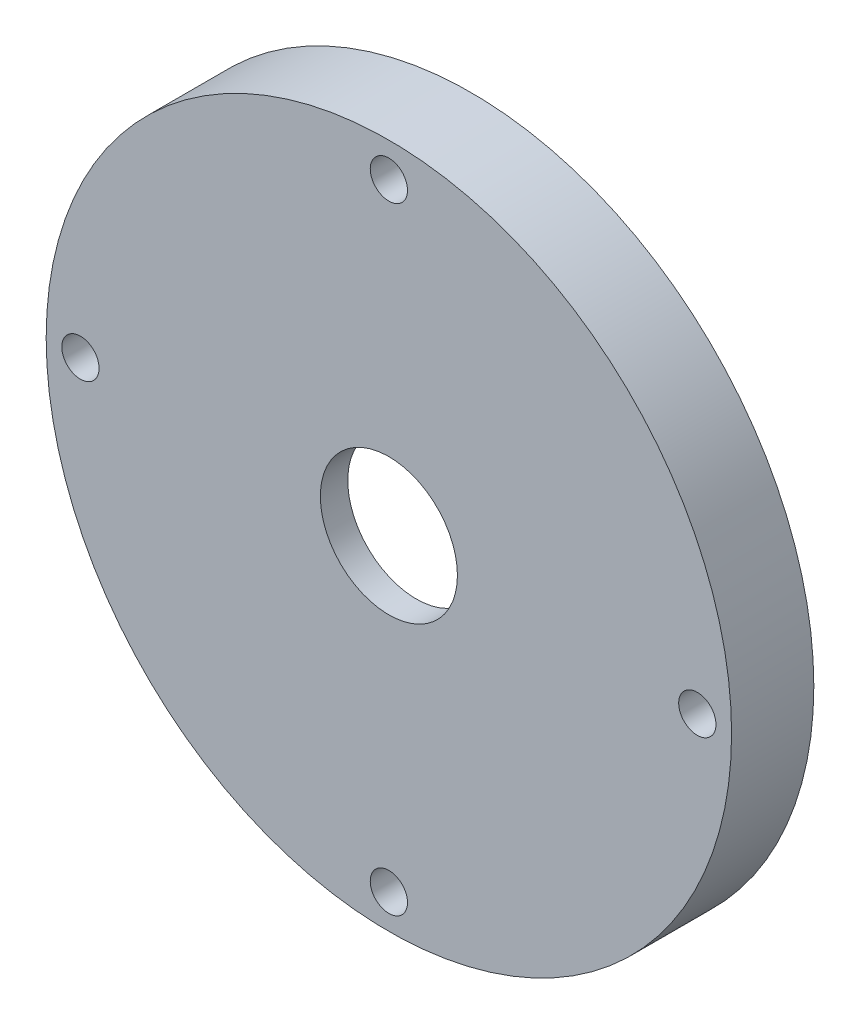
ISO-10303-21;
HEADER;
FILE_DESCRIPTION(('STEP AP214'),'2;1');
FILE_NAME('part.step','',(''),(''),'','','');
FILE_SCHEMA(('AUTOMOTIVE_DESIGN { 1 0 10303 214 1 1 1 1 }'));
ENDSEC;
DATA;
#1=APPLICATION_CONTEXT('core data for automotive mechanical design processes');
#2=APPLICATION_PROTOCOL_DEFINITION('international standard','automotive_design',2000,#1);
#3=PRODUCT_CONTEXT('',#1,'mechanical');
#4=PRODUCT('Part','Part','',(#3));
#5=PRODUCT_RELATED_PRODUCT_CATEGORY('part','',(#4));
#6=PRODUCT_DEFINITION_FORMATION('','',#4);
#7=PRODUCT_DEFINITION_CONTEXT('part definition',#1,'design');
#8=PRODUCT_DEFINITION('design','',#6,#7);
#9=PRODUCT_DEFINITION_SHAPE('','',#8);
#10=(LENGTH_UNIT() NAMED_UNIT(*) SI_UNIT(.MILLI.,.METRE.));
#11=(NAMED_UNIT(*) PLANE_ANGLE_UNIT() SI_UNIT($,.RADIAN.));
#12=(NAMED_UNIT(*) SI_UNIT($,.STERADIAN.) SOLID_ANGLE_UNIT());
#13=UNCERTAINTY_MEASURE_WITH_UNIT(LENGTH_MEASURE(1.E-05),#10,'distance_accuracy_value','');
#14=(GEOMETRIC_REPRESENTATION_CONTEXT(3) GLOBAL_UNCERTAINTY_ASSIGNED_CONTEXT((#13)) GLOBAL_UNIT_ASSIGNED_CONTEXT((#10,
#11,#12)) REPRESENTATION_CONTEXT('',''));
#15=CARTESIAN_POINT('',(0.,0.,0.));
#16=DIRECTION('',(0.,0.,1.));
#17=DIRECTION('',(1.,0.,0.));
#18=AXIS2_PLACEMENT_3D('',#15,#16,#17);
#19=CARTESIAN_POINT('',(0.,0.,0.));
#20=DIRECTION('',(0.,0.,1.));
#21=DIRECTION('',(1.,0.,0.));
#22=AXIS2_PLACEMENT_3D('',#19,#20,#21);
#23=PLANE('',#22);
#24=CARTESIAN_POINT('',(0.,28.575,0.));
#25=DIRECTION('',(0.,0.,-1.));
#26=DIRECTION('',(-1.,0.,0.));
#27=AXIS2_PLACEMENT_3D('',#24,#25,#26);
#28=CIRCLE('',#27,1.7272);
#29=CARTESIAN_POINT('',(-1.7272,28.575,0.));
#30=VERTEX_POINT('',#29);
#31=EDGE_CURVE('E69',#30,#30,#28,.T.);
#32=ORIENTED_EDGE('',*,*,#31,.F.);
#33=EDGE_LOOP('',(#32));
#34=FACE_BOUND('',#33,.T.);
#35=CARTESIAN_POINT('',(-28.575,0.,0.));
#36=DIRECTION('',(0.,0.,-1.));
#37=DIRECTION('',(-1.,0.,0.));
#38=AXIS2_PLACEMENT_3D('',#35,#36,#37);
#39=CIRCLE('',#38,1.7272);
#40=CARTESIAN_POINT('',(-30.3022,0.,0.));
#41=VERTEX_POINT('',#40);
#42=EDGE_CURVE('E63',#41,#41,#39,.T.);
#43=ORIENTED_EDGE('',*,*,#42,.F.);
#44=EDGE_LOOP('',(#43));
#45=FACE_BOUND('',#44,.T.);
#46=CARTESIAN_POINT('',(1.99538158514885E-13,-28.575,0.));
#47=DIRECTION('',(0.,0.,-1.));
#48=DIRECTION('',(-1.,0.,0.));
#49=AXIS2_PLACEMENT_3D('',#46,#47,#48);
#50=CIRCLE('',#49,1.7272);
#51=CARTESIAN_POINT('',(-1.7271999999998,-28.575,0.));
#52=VERTEX_POINT('',#51);
#53=EDGE_CURVE('E55',#52,#52,#50,.T.);
#54=ORIENTED_EDGE('',*,*,#53,.F.);
#55=EDGE_LOOP('',(#54));
#56=FACE_BOUND('',#55,.T.);
#57=CARTESIAN_POINT('',(28.575,2.99307237772328E-13,0.));
#58=DIRECTION('',(0.,0.,-1.));
#59=DIRECTION('',(-1.,0.,0.));
#60=AXIS2_PLACEMENT_3D('',#57,#58,#59);
#61=CIRCLE('',#60,1.7272);
#62=CARTESIAN_POINT('',(26.8478,2.99307237772328E-13,0.));
#63=VERTEX_POINT('',#62);
#64=EDGE_CURVE('E56',#63,#63,#61,.T.);
#65=ORIENTED_EDGE('',*,*,#64,.F.);
#66=EDGE_LOOP('',(#65));
#67=FACE_BOUND('',#66,.T.);
#68=CARTESIAN_POINT('',(0.,0.,0.));
#69=DIRECTION('',(0.,0.,1.));
#70=DIRECTION('',(1.,0.,0.));
#71=AXIS2_PLACEMENT_3D('',#68,#69,#70);
#72=CIRCLE('',#71,31.75);
#73=CARTESIAN_POINT('',(31.75,0.,0.));
#74=VERTEX_POINT('',#73);
#75=EDGE_CURVE('E10',#74,#74,#72,.T.);
#76=ORIENTED_EDGE('',*,*,#75,.F.);
#77=EDGE_LOOP('',(#76));
#78=FACE_BOUND('',#77,.T.);
#79=CARTESIAN_POINT('',(0.,0.,0.));
#80=DIRECTION('',(0.,0.,1.));
#81=DIRECTION('',(1.,0.,0.));
#82=AXIS2_PLACEMENT_3D('',#79,#80,#81);
#83=CIRCLE('',#82,21.59);
#84=CARTESIAN_POINT('',(21.59,0.,0.));
#85=VERTEX_POINT('',#84);
#86=EDGE_CURVE('E38',#85,#85,#83,.T.);
#87=ORIENTED_EDGE('',*,*,#86,.T.);
#88=EDGE_LOOP('',(#87));
#89=FACE_BOUND('',#88,.T.);
#90=ADVANCED_FACE('F31',(#34,#45,#56,#67,#78,#89),#23,.F.);
#91=CARTESIAN_POINT('',(0.,0.,5.08));
#92=DIRECTION('',(0.,0.,-1.));
#93=DIRECTION('',(-1.,0.,0.));
#94=AXIS2_PLACEMENT_3D('',#91,#92,#93);
#95=CYLINDRICAL_SURFACE('',#94,31.75);
#96=ORIENTED_EDGE('',*,*,#75,.T.);
#97=EDGE_LOOP('',(#96));
#98=FACE_BOUND('',#97,.T.);
#99=CARTESIAN_POINT('',(0.,0.,7.62));
#100=DIRECTION('',(0.,0.,1.));
#101=DIRECTION('',(1.,0.,0.));
#102=AXIS2_PLACEMENT_3D('',#99,#100,#101);
#103=CIRCLE('',#102,31.75);
#104=CARTESIAN_POINT('',(31.75,0.,7.62));
#105=VERTEX_POINT('',#104);
#106=EDGE_CURVE('E46',#105,#105,#103,.T.);
#107=ORIENTED_EDGE('',*,*,#106,.F.);
#108=EDGE_LOOP('',(#107));
#109=FACE_BOUND('',#108,.T.);
#110=ADVANCED_FACE('F33',(#98,#109),#95,.T.);
#111=CARTESIAN_POINT('',(0.,0.,5.08));
#112=DIRECTION('',(0.,0.,-1.));
#113=DIRECTION('',(-1.,0.,0.));
#114=AXIS2_PLACEMENT_3D('',#111,#112,#113);
#115=CYLINDRICAL_SURFACE('',#114,21.59);
#116=CARTESIAN_POINT('',(0.,0.,5.08));
#117=DIRECTION('',(0.,0.,1.));
#118=DIRECTION('',(1.,0.,0.));
#119=AXIS2_PLACEMENT_3D('',#116,#117,#118);
#120=CIRCLE('',#119,21.59);
#121=CARTESIAN_POINT('',(21.59,0.,5.08));
#122=VERTEX_POINT('',#121);
#123=EDGE_CURVE('E42',#122,#122,#120,.T.);
#124=ORIENTED_EDGE('',*,*,#123,.T.);
#125=EDGE_LOOP('',(#124));
#126=FACE_BOUND('',#125,.T.);
#127=ORIENTED_EDGE('',*,*,#86,.F.);
#128=EDGE_LOOP('',(#127));
#129=FACE_BOUND('',#128,.T.);
#130=ADVANCED_FACE('F101',(#126,#129),#115,.F.);
#131=CARTESIAN_POINT('',(0.,0.,5.08));
#132=DIRECTION('',(0.,0.,1.));
#133=DIRECTION('',(1.,0.,0.));
#134=AXIS2_PLACEMENT_3D('',#131,#132,#133);
#135=PLANE('',#134);
#136=CARTESIAN_POINT('',(0.,0.,5.08));
#137=DIRECTION('',(0.,0.,1.));
#138=DIRECTION('',(1.,0.,0.));
#139=AXIS2_PLACEMENT_3D('',#136,#137,#138);
#140=CIRCLE('',#139,6.35);
#141=CARTESIAN_POINT('',(6.35,0.,5.08));
#142=VERTEX_POINT('',#141);
#143=EDGE_CURVE('E59',#142,#142,#140,.F.);
#144=ORIENTED_EDGE('',*,*,#143,.F.);
#145=EDGE_LOOP('',(#144));
#146=FACE_BOUND('',#145,.T.);
#147=ORIENTED_EDGE('',*,*,#123,.F.);
#148=EDGE_LOOP('',(#147));
#149=FACE_BOUND('',#148,.T.);
#150=ADVANCED_FACE('F88',(#146,#149),#135,.F.);
#151=CARTESIAN_POINT('',(0.,0.,7.62));
#152=DIRECTION('',(0.,0.,1.));
#153=DIRECTION('',(1.,0.,0.));
#154=AXIS2_PLACEMENT_3D('',#151,#152,#153);
#155=PLANE('',#154);
#156=CARTESIAN_POINT('',(0.,0.,7.62));
#157=DIRECTION('',(0.,0.,1.));
#158=DIRECTION('',(1.,0.,0.));
#159=AXIS2_PLACEMENT_3D('',#156,#157,#158);
#160=CIRCLE('',#159,6.35);
#161=CARTESIAN_POINT('',(6.35,0.,7.62));
#162=VERTEX_POINT('',#161);
#163=EDGE_CURVE('E78',#162,#162,#160,.T.);
#164=ORIENTED_EDGE('',*,*,#163,.F.);
#165=EDGE_LOOP('',(#164));
#166=FACE_BOUND('',#165,.T.);
#167=CARTESIAN_POINT('',(0.,28.575,7.62));
#168=DIRECTION('',(0.,0.,1.));
#169=DIRECTION('',(1.,0.,0.));
#170=AXIS2_PLACEMENT_3D('',#167,#168,#169);
#171=CIRCLE('',#170,1.7272);
#172=CARTESIAN_POINT('',(1.7272,28.575,7.62));
#173=VERTEX_POINT('',#172);
#174=EDGE_CURVE('E51',#173,#173,#171,.F.);
#175=ORIENTED_EDGE('',*,*,#174,.T.);
#176=EDGE_LOOP('',(#175));
#177=FACE_BOUND('',#176,.T.);
#178=CARTESIAN_POINT('',(-28.575,0.,7.62));
#179=DIRECTION('',(0.,0.,1.));
#180=DIRECTION('',(1.,0.,0.));
#181=AXIS2_PLACEMENT_3D('',#178,#179,#180);
#182=CIRCLE('',#181,1.7272);
#183=CARTESIAN_POINT('',(-26.8478,0.,7.62));
#184=VERTEX_POINT('',#183);
#185=EDGE_CURVE('E66',#184,#184,#182,.F.);
#186=ORIENTED_EDGE('',*,*,#185,.T.);
#187=EDGE_LOOP('',(#186));
#188=FACE_BOUND('',#187,.T.);
#189=CARTESIAN_POINT('',(1.99538158514885E-13,-28.575,7.62));
#190=DIRECTION('',(0.,0.,1.));
#191=DIRECTION('',(1.,0.,0.));
#192=AXIS2_PLACEMENT_3D('',#189,#190,#191);
#193=CIRCLE('',#192,1.7272);
#194=CARTESIAN_POINT('',(1.7272000000002,-28.575,7.62));
#195=VERTEX_POINT('',#194);
#196=EDGE_CURVE('E60',#195,#195,#193,.F.);
#197=ORIENTED_EDGE('',*,*,#196,.T.);
#198=EDGE_LOOP('',(#197));
#199=FACE_BOUND('',#198,.T.);
#200=CARTESIAN_POINT('',(28.575,2.99307237772328E-13,7.62));
#201=DIRECTION('',(0.,0.,1.));
#202=DIRECTION('',(1.,0.,0.));
#203=AXIS2_PLACEMENT_3D('',#200,#201,#202);
#204=CIRCLE('',#203,1.7272);
#205=CARTESIAN_POINT('',(30.3022,2.99307237772328E-13,7.62));
#206=VERTEX_POINT('',#205);
#207=EDGE_CURVE('E52',#206,#206,#204,.F.);
#208=ORIENTED_EDGE('',*,*,#207,.T.);
#209=EDGE_LOOP('',(#208));
#210=FACE_BOUND('',#209,.T.);
#211=ORIENTED_EDGE('',*,*,#106,.T.);
#212=EDGE_LOOP('',(#211));
#213=FACE_BOUND('',#212,.T.);
#214=ADVANCED_FACE('F84',(#166,#177,#188,#199,#210,#213),#155,.T.);
#215=CARTESIAN_POINT('',(28.575,2.99307237772328E-13,12.5052593298616));
#216=DIRECTION('',(0.,0.,-1.));
#217=DIRECTION('',(-1.,0.,0.));
#218=AXIS2_PLACEMENT_3D('',#215,#216,#217);
#219=CYLINDRICAL_SURFACE('',#218,1.7272);
#220=ORIENTED_EDGE('',*,*,#64,.T.);
#221=EDGE_LOOP('',(#220));
#222=FACE_BOUND('',#221,.T.);
#223=ORIENTED_EDGE('',*,*,#207,.F.);
#224=EDGE_LOOP('',(#223));
#225=FACE_BOUND('',#224,.T.);
#226=ADVANCED_FACE('F87',(#222,#225),#219,.F.);
#227=CARTESIAN_POINT('',(1.99538158514885E-13,-28.575,12.5052593298616));
#228=DIRECTION('',(0.,0.,-1.));
#229=DIRECTION('',(-1.,0.,0.));
#230=AXIS2_PLACEMENT_3D('',#227,#228,#229);
#231=CYLINDRICAL_SURFACE('',#230,1.7272);
#232=ORIENTED_EDGE('',*,*,#53,.T.);
#233=EDGE_LOOP('',(#232));
#234=FACE_BOUND('',#233,.T.);
#235=ORIENTED_EDGE('',*,*,#196,.F.);
#236=EDGE_LOOP('',(#235));
#237=FACE_BOUND('',#236,.T.);
#238=ADVANCED_FACE('F119',(#234,#237),#231,.F.);
#239=CARTESIAN_POINT('',(-28.575,0.,12.5052593298616));
#240=DIRECTION('',(0.,0.,-1.));
#241=DIRECTION('',(-1.,0.,0.));
#242=AXIS2_PLACEMENT_3D('',#239,#240,#241);
#243=CYLINDRICAL_SURFACE('',#242,1.7272);
#244=ORIENTED_EDGE('',*,*,#42,.T.);
#245=EDGE_LOOP('',(#244));
#246=FACE_BOUND('',#245,.T.);
#247=ORIENTED_EDGE('',*,*,#185,.F.);
#248=EDGE_LOOP('',(#247));
#249=FACE_BOUND('',#248,.T.);
#250=ADVANCED_FACE('F123',(#246,#249),#243,.F.);
#251=CARTESIAN_POINT('',(0.,28.575,12.5052593298616));
#252=DIRECTION('',(0.,0.,-1.));
#253=DIRECTION('',(-1.,0.,0.));
#254=AXIS2_PLACEMENT_3D('',#251,#252,#253);
#255=CYLINDRICAL_SURFACE('',#254,1.7272);
#256=ORIENTED_EDGE('',*,*,#31,.T.);
#257=EDGE_LOOP('',(#256));
#258=FACE_BOUND('',#257,.T.);
#259=ORIENTED_EDGE('',*,*,#174,.F.);
#260=EDGE_LOOP('',(#259));
#261=FACE_BOUND('',#260,.T.);
#262=ADVANCED_FACE('F127',(#258,#261),#255,.F.);
#263=CARTESIAN_POINT('',(0.,0.,-12.8805122421383));
#264=DIRECTION('',(0.,0.,1.));
#265=DIRECTION('',(1.,0.,0.));
#266=AXIS2_PLACEMENT_3D('',#263,#264,#265);
#267=CYLINDRICAL_SURFACE('',#266,6.35);
#268=ORIENTED_EDGE('',*,*,#143,.T.);
#269=EDGE_LOOP('',(#268));
#270=FACE_BOUND('',#269,.T.);
#271=ORIENTED_EDGE('',*,*,#163,.T.);
#272=EDGE_LOOP('',(#271));
#273=FACE_BOUND('',#272,.T.);
#274=ADVANCED_FACE('F82',(#270,#273),#267,.F.);
#275=CLOSED_SHELL('',(#90,#110,#130,#150,#214,#226,#238,#250,#262,#274));
#276=MANIFOLD_SOLID_BREP('B2',#275);
#277=ADVANCED_BREP_SHAPE_REPRESENTATION('',(#18,#276),#14);
#278=SHAPE_DEFINITION_REPRESENTATION(#9,#277);
ENDSEC;
END-ISO-10303-21;
